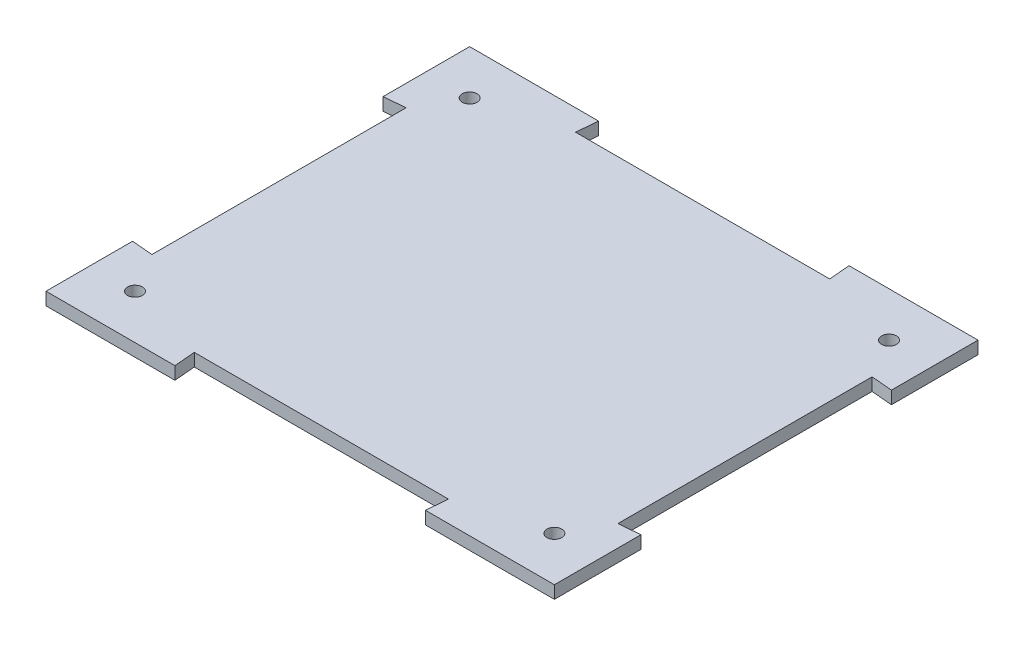
ISO-10303-21;
HEADER;
FILE_DESCRIPTION(('STEP AP214'),'2;1');
FILE_NAME('part.step','',(''),(''),'','','');
FILE_SCHEMA(('AUTOMOTIVE_DESIGN { 1 0 10303 214 1 1 1 1 }'));
ENDSEC;
DATA;
#1=APPLICATION_CONTEXT('core data for automotive mechanical design processes');
#2=APPLICATION_PROTOCOL_DEFINITION('international standard','automotive_design',2000,#1);
#3=PRODUCT_CONTEXT('',#1,'mechanical');
#4=PRODUCT('Part','Part','',(#3));
#5=PRODUCT_RELATED_PRODUCT_CATEGORY('part','',(#4));
#6=PRODUCT_DEFINITION_FORMATION('','',#4);
#7=PRODUCT_DEFINITION_CONTEXT('part definition',#1,'design');
#8=PRODUCT_DEFINITION('design','',#6,#7);
#9=PRODUCT_DEFINITION_SHAPE('','',#8);
#10=(LENGTH_UNIT() NAMED_UNIT(*) SI_UNIT(.MILLI.,.METRE.));
#11=(NAMED_UNIT(*) PLANE_ANGLE_UNIT() SI_UNIT($,.RADIAN.));
#12=(NAMED_UNIT(*) SI_UNIT($,.STERADIAN.) SOLID_ANGLE_UNIT());
#13=UNCERTAINTY_MEASURE_WITH_UNIT(LENGTH_MEASURE(1.E-05),#10,'distance_accuracy_value','');
#14=(GEOMETRIC_REPRESENTATION_CONTEXT(3) GLOBAL_UNCERTAINTY_ASSIGNED_CONTEXT((#13)) GLOBAL_UNIT_ASSIGNED_CONTEXT((#10,
#11,#12)) REPRESENTATION_CONTEXT('',''));
#15=CARTESIAN_POINT('',(0.,0.,0.));
#16=DIRECTION('',(0.,0.,1.));
#17=DIRECTION('',(1.,0.,0.));
#18=AXIS2_PLACEMENT_3D('',#15,#16,#17);
#19=CARTESIAN_POINT('',(0.,3.,0.));
#20=DIRECTION('',(0.,0.,-1.));
#21=DIRECTION('',(-1.,0.,0.));
#22=AXIS2_PLACEMENT_3D('',#19,#20,#21);
#23=PLANE('',#22);
#24=DIRECTION('',(1.,0.,0.));
#25=VECTOR('',#24,1.);
#26=CARTESIAN_POINT('',(0.,0.,0.));
#27=LINE('',#26,#25);
#28=CARTESIAN_POINT('',(0.,0.,0.));
#29=VERTEX_POINT('',#28);
#30=CARTESIAN_POINT('',(30.4374433176297,0.,0.));
#31=VERTEX_POINT('',#30);
#32=EDGE_CURVE('E207',#29,#31,#27,.T.);
#33=ORIENTED_EDGE('',*,*,#32,.T.);
#34=DIRECTION('',(0.,1.,0.));
#35=VECTOR('',#34,1.);
#36=CARTESIAN_POINT('',(30.4374433176297,-7.,0.));
#37=LINE('',#36,#35);
#38=CARTESIAN_POINT('',(30.4374433176297,3.,0.));
#39=VERTEX_POINT('',#38);
#40=EDGE_CURVE('E302',#31,#39,#37,.T.);
#41=ORIENTED_EDGE('',*,*,#40,.T.);
#42=DIRECTION('',(1.,0.,0.));
#43=VECTOR('',#42,1.);
#44=CARTESIAN_POINT('',(0.,3.,0.));
#45=LINE('',#44,#43);
#46=CARTESIAN_POINT('',(0.,3.,0.));
#47=VERTEX_POINT('',#46);
#48=EDGE_CURVE('E267',#47,#39,#45,.T.);
#49=ORIENTED_EDGE('',*,*,#48,.F.);
#50=DIRECTION('',(0.,-1.,0.));
#51=VECTOR('',#50,1.);
#52=CARTESIAN_POINT('',(0.,3.,0.));
#53=LINE('',#52,#51);
#54=EDGE_CURVE('E226',#47,#29,#53,.T.);
#55=ORIENTED_EDGE('',*,*,#54,.T.);
#56=EDGE_LOOP('',(#33,#41,#49,#55));
#57=FACE_BOUND('',#56,.T.);
#58=ADVANCED_FACE('F33',(#57),#23,.F.);
#59=CARTESIAN_POINT('',(120.,3.,0.));
#60=DIRECTION('',(-1.,0.,0.));
#61=DIRECTION('',(0.,0.,1.));
#62=AXIS2_PLACEMENT_3D('',#59,#60,#61);
#63=PLANE('',#62);
#64=DIRECTION('',(0.,0.,-1.));
#65=VECTOR('',#64,1.);
#66=CARTESIAN_POINT('',(120.,0.,0.));
#67=LINE('',#66,#65);
#68=CARTESIAN_POINT('',(120.,0.,0.));
#69=VERTEX_POINT('',#68);
#70=CARTESIAN_POINT('',(120.,0.,-20.4374433176296));
#71=VERTEX_POINT('',#70);
#72=EDGE_CURVE('E211',#69,#71,#67,.T.);
#73=ORIENTED_EDGE('',*,*,#72,.T.);
#74=DIRECTION('',(0.,1.,0.));
#75=VECTOR('',#74,1.);
#76=CARTESIAN_POINT('',(120.,-7.,-20.4374433176296));
#77=LINE('',#76,#75);
#78=CARTESIAN_POINT('',(120.,3.,-20.4374433176296));
#79=VERTEX_POINT('',#78);
#80=EDGE_CURVE('E188',#71,#79,#77,.T.);
#81=ORIENTED_EDGE('',*,*,#80,.T.);
#82=DIRECTION('',(0.,0.,-1.));
#83=VECTOR('',#82,1.);
#84=CARTESIAN_POINT('',(120.,3.,0.));
#85=LINE('',#84,#83);
#86=CARTESIAN_POINT('',(120.,3.,0.));
#87=VERTEX_POINT('',#86);
#88=EDGE_CURVE('E195',#87,#79,#85,.T.);
#89=ORIENTED_EDGE('',*,*,#88,.F.);
#90=DIRECTION('',(0.,-1.,0.));
#91=VECTOR('',#90,1.);
#92=CARTESIAN_POINT('',(120.,3.,0.));
#93=LINE('',#92,#91);
#94=EDGE_CURVE('E223',#87,#69,#93,.T.);
#95=ORIENTED_EDGE('',*,*,#94,.T.);
#96=EDGE_LOOP('',(#73,#81,#89,#95));
#97=FACE_BOUND('',#96,.T.);
#98=ADVANCED_FACE('F371',(#97),#63,.F.);
#99=CARTESIAN_POINT('',(0.,3.,-100.));
#100=DIRECTION('',(0.,0.,1.));
#101=DIRECTION('',(1.,0.,0.));
#102=AXIS2_PLACEMENT_3D('',#99,#100,#101);
#103=PLANE('',#102);
#104=DIRECTION('',(-1.,0.,0.));
#105=VECTOR('',#104,1.);
#106=CARTESIAN_POINT('',(0.,0.,-100.));
#107=LINE('',#106,#105);
#108=CARTESIAN_POINT('',(120.,0.,-100.));
#109=VERTEX_POINT('',#108);
#110=CARTESIAN_POINT('',(89.5625566823704,0.,-100.));
#111=VERTEX_POINT('',#110);
#112=EDGE_CURVE('E215',#109,#111,#107,.T.);
#113=ORIENTED_EDGE('',*,*,#112,.T.);
#114=DIRECTION('',(0.,1.,0.));
#115=VECTOR('',#114,1.);
#116=CARTESIAN_POINT('',(89.5625566823704,-7.,-100.));
#117=LINE('',#116,#115);
#118=CARTESIAN_POINT('',(89.5625566823704,3.,-100.));
#119=VERTEX_POINT('',#118);
#120=EDGE_CURVE('E288',#111,#119,#117,.T.);
#121=ORIENTED_EDGE('',*,*,#120,.T.);
#122=DIRECTION('',(-1.,0.,0.));
#123=VECTOR('',#122,1.);
#124=CARTESIAN_POINT('',(0.,3.,-100.));
#125=LINE('',#124,#123);
#126=CARTESIAN_POINT('',(120.,3.,-100.));
#127=VERTEX_POINT('',#126);
#128=EDGE_CURVE('E194',#127,#119,#125,.T.);
#129=ORIENTED_EDGE('',*,*,#128,.F.);
#130=DIRECTION('',(0.,-1.,0.));
#131=VECTOR('',#130,1.);
#132=CARTESIAN_POINT('',(120.,3.,-100.));
#133=LINE('',#132,#131);
#134=EDGE_CURVE('E220',#127,#109,#133,.T.);
#135=ORIENTED_EDGE('',*,*,#134,.T.);
#136=EDGE_LOOP('',(#113,#121,#129,#135));
#137=FACE_BOUND('',#136,.T.);
#138=ADVANCED_FACE('F287',(#137),#103,.F.);
#139=CARTESIAN_POINT('',(0.,3.,0.));
#140=DIRECTION('',(1.,0.,0.));
#141=DIRECTION('',(0.,0.,-1.));
#142=AXIS2_PLACEMENT_3D('',#139,#140,#141);
#143=PLANE('',#142);
#144=DIRECTION('',(0.,0.,1.));
#145=VECTOR('',#144,1.);
#146=CARTESIAN_POINT('',(0.,0.,0.));
#147=LINE('',#146,#145);
#148=CARTESIAN_POINT('',(0.,0.,-100.));
#149=VERTEX_POINT('',#148);
#150=CARTESIAN_POINT('',(0.,0.,-79.5625566823703));
#151=VERTEX_POINT('',#150);
#152=EDGE_CURVE('E202',#149,#151,#147,.T.);
#153=ORIENTED_EDGE('',*,*,#152,.T.);
#154=DIRECTION('',(0.,1.,0.));
#155=VECTOR('',#154,1.);
#156=CARTESIAN_POINT('',(0.,-7.,-79.5625566823703));
#157=LINE('',#156,#155);
#158=CARTESIAN_POINT('',(0.,3.,-79.5625566823703));
#159=VERTEX_POINT('',#158);
#160=EDGE_CURVE('E263',#151,#159,#157,.T.);
#161=ORIENTED_EDGE('',*,*,#160,.T.);
#162=DIRECTION('',(0.,0.,1.));
#163=VECTOR('',#162,1.);
#164=CARTESIAN_POINT('',(0.,3.,0.));
#165=LINE('',#164,#163);
#166=CARTESIAN_POINT('',(0.,3.,-100.));
#167=VERTEX_POINT('',#166);
#168=EDGE_CURVE('E262',#167,#159,#165,.T.);
#169=ORIENTED_EDGE('',*,*,#168,.F.);
#170=DIRECTION('',(0.,-1.,0.));
#171=VECTOR('',#170,1.);
#172=CARTESIAN_POINT('',(0.,3.,-100.));
#173=LINE('',#172,#171);
#174=EDGE_CURVE('E192',#167,#149,#173,.T.);
#175=ORIENTED_EDGE('',*,*,#174,.T.);
#176=EDGE_LOOP('',(#153,#161,#169,#175));
#177=FACE_BOUND('',#176,.T.);
#178=ADVANCED_FACE('F260',(#177),#143,.F.);
#179=CARTESIAN_POINT('',(0.,3.,-20.4374433176296));
#180=VERTEX_POINT('',#179);
#181=EDGE_CURVE('E218',#180,#47,#165,.T.);
#182=ORIENTED_EDGE('',*,*,#181,.F.);
#183=DIRECTION('',(0.,1.,0.));
#184=VECTOR('',#183,1.);
#185=CARTESIAN_POINT('',(0.,-7.,-20.4374433176296));
#186=LINE('',#185,#184);
#187=CARTESIAN_POINT('',(0.,0.,-20.4374433176296));
#188=VERTEX_POINT('',#187);
#189=EDGE_CURVE('E269',#188,#180,#186,.T.);
#190=ORIENTED_EDGE('',*,*,#189,.F.);
#191=EDGE_CURVE('E206',#188,#29,#147,.T.);
#192=ORIENTED_EDGE('',*,*,#191,.T.);
#193=ORIENTED_EDGE('',*,*,#54,.F.);
#194=EDGE_LOOP('',(#182,#190,#192,#193));
#195=FACE_BOUND('',#194,.T.);
#196=ADVANCED_FACE('F35',(#195),#143,.F.);
#197=CARTESIAN_POINT('',(89.5625566823704,3.,0.));
#198=VERTEX_POINT('',#197);
#199=EDGE_CURVE('E265',#198,#87,#45,.T.);
#200=ORIENTED_EDGE('',*,*,#199,.F.);
#201=DIRECTION('',(0.,1.,0.));
#202=VECTOR('',#201,1.);
#203=CARTESIAN_POINT('',(89.5625566823704,-7.,0.));
#204=LINE('',#203,#202);
#205=CARTESIAN_POINT('',(89.5625566823704,0.,0.));
#206=VERTEX_POINT('',#205);
#207=EDGE_CURVE('E323',#206,#198,#204,.T.);
#208=ORIENTED_EDGE('',*,*,#207,.F.);
#209=EDGE_CURVE('E205',#206,#69,#27,.T.);
#210=ORIENTED_EDGE('',*,*,#209,.T.);
#211=ORIENTED_EDGE('',*,*,#94,.F.);
#212=EDGE_LOOP('',(#200,#208,#210,#211));
#213=FACE_BOUND('',#212,.T.);
#214=ADVANCED_FACE('F367',(#213),#23,.F.);
#215=CARTESIAN_POINT('',(120.,3.,-79.5625566823704));
#216=VERTEX_POINT('',#215);
#217=EDGE_CURVE('E198',#216,#127,#85,.T.);
#218=ORIENTED_EDGE('',*,*,#217,.F.);
#219=DIRECTION('',(0.,1.,0.));
#220=VECTOR('',#219,1.);
#221=CARTESIAN_POINT('',(120.,-7.,-79.5625566823704));
#222=LINE('',#221,#220);
#223=CARTESIAN_POINT('',(120.,0.,-79.5625566823704));
#224=VERTEX_POINT('',#223);
#225=EDGE_CURVE('E307',#224,#216,#222,.T.);
#226=ORIENTED_EDGE('',*,*,#225,.F.);
#227=EDGE_CURVE('E210',#224,#109,#67,.T.);
#228=ORIENTED_EDGE('',*,*,#227,.T.);
#229=ORIENTED_EDGE('',*,*,#134,.F.);
#230=EDGE_LOOP('',(#218,#226,#228,#229));
#231=FACE_BOUND('',#230,.T.);
#232=ADVANCED_FACE('F282',(#231),#63,.F.);
#233=CARTESIAN_POINT('',(30.4374433176296,3.,-100.));
#234=VERTEX_POINT('',#233);
#235=EDGE_CURVE('E183',#234,#167,#125,.T.);
#236=ORIENTED_EDGE('',*,*,#235,.F.);
#237=DIRECTION('',(0.,1.,0.));
#238=VECTOR('',#237,1.);
#239=CARTESIAN_POINT('',(30.4374433176296,-7.,-100.));
#240=LINE('',#239,#238);
#241=CARTESIAN_POINT('',(30.4374433176296,0.,-100.));
#242=VERTEX_POINT('',#241);
#243=EDGE_CURVE('E167',#242,#234,#240,.T.);
#244=ORIENTED_EDGE('',*,*,#243,.F.);
#245=EDGE_CURVE('E214',#242,#149,#107,.T.);
#246=ORIENTED_EDGE('',*,*,#245,.T.);
#247=ORIENTED_EDGE('',*,*,#174,.F.);
#248=EDGE_LOOP('',(#236,#244,#246,#247));
#249=FACE_BOUND('',#248,.T.);
#250=ADVANCED_FACE('F190',(#249),#103,.F.);
#251=CARTESIAN_POINT('',(0.,3.,0.));
#252=DIRECTION('',(0.,-1.,0.));
#253=DIRECTION('',(0.,0.,-1.));
#254=AXIS2_PLACEMENT_3D('',#251,#252,#253);
#255=PLANE('',#254);
#256=CARTESIAN_POINT('',(109.5,3.,-89.5));
#257=DIRECTION('',(0.,1.,0.));
#258=DIRECTION('',(0.,0.,1.));
#259=AXIS2_PLACEMENT_3D('',#256,#257,#258);
#260=CIRCLE('',#259,1.75);
#261=CARTESIAN_POINT('',(109.5,3.,-87.75));
#262=VERTEX_POINT('',#261);
#263=EDGE_CURVE('E387',#262,#262,#260,.T.);
#264=ORIENTED_EDGE('',*,*,#263,.F.);
#265=EDGE_LOOP('',(#264));
#266=FACE_BOUND('',#265,.T.);
#267=CARTESIAN_POINT('',(109.5,3.,-10.5));
#268=DIRECTION('',(0.,1.,0.));
#269=DIRECTION('',(0.,0.,1.));
#270=AXIS2_PLACEMENT_3D('',#267,#268,#269);
#271=CIRCLE('',#270,1.75);
#272=CARTESIAN_POINT('',(109.5,3.,-8.75000000000003));
#273=VERTEX_POINT('',#272);
#274=EDGE_CURVE('E399',#273,#273,#271,.T.);
#275=ORIENTED_EDGE('',*,*,#274,.F.);
#276=EDGE_LOOP('',(#275));
#277=FACE_BOUND('',#276,.T.);
#278=CARTESIAN_POINT('',(10.5,3.,-10.5));
#279=DIRECTION('',(0.,1.,0.));
#280=DIRECTION('',(0.,0.,1.));
#281=AXIS2_PLACEMENT_3D('',#278,#279,#280);
#282=CIRCLE('',#281,1.75);
#283=CARTESIAN_POINT('',(10.5,3.,-8.75000000000002));
#284=VERTEX_POINT('',#283);
#285=EDGE_CURVE('E393',#284,#284,#282,.T.);
#286=ORIENTED_EDGE('',*,*,#285,.F.);
#287=EDGE_LOOP('',(#286));
#288=FACE_BOUND('',#287,.T.);
#289=CARTESIAN_POINT('',(10.5,3.,-89.5));
#290=DIRECTION('',(0.,1.,0.));
#291=DIRECTION('',(0.,0.,1.));
#292=AXIS2_PLACEMENT_3D('',#289,#290,#291);
#293=CIRCLE('',#292,1.75);
#294=CARTESIAN_POINT('',(10.5,3.,-87.75));
#295=VERTEX_POINT('',#294);
#296=EDGE_CURVE('E318',#295,#295,#293,.T.);
#297=ORIENTED_EDGE('',*,*,#296,.F.);
#298=EDGE_LOOP('',(#297));
#299=FACE_BOUND('',#298,.T.);
#300=ORIENTED_EDGE('',*,*,#128,.T.);
#301=DIRECTION('',(-0.0871557427476621,0.,-0.996194698091745));
#302=VECTOR('',#301,1.);
#303=CARTESIAN_POINT('',(90.,3.,-95.));
#304=LINE('',#303,#302);
#305=CARTESIAN_POINT('',(90.,3.,-95.));
#306=VERTEX_POINT('',#305);
#307=EDGE_CURVE('E177',#306,#119,#304,.T.);
#308=ORIENTED_EDGE('',*,*,#307,.F.);
#309=DIRECTION('',(1.,0.,0.));
#310=VECTOR('',#309,1.);
#311=CARTESIAN_POINT('',(30.,3.,-95.));
#312=LINE('',#311,#310);
#313=CARTESIAN_POINT('',(30.,3.,-95.));
#314=VERTEX_POINT('',#313);
#315=EDGE_CURVE('E187',#314,#306,#312,.T.);
#316=ORIENTED_EDGE('',*,*,#315,.F.);
#317=DIRECTION('',(-0.0871557427476608,0.,0.996194698091745));
#318=VECTOR('',#317,1.);
#319=CARTESIAN_POINT('',(30.4374433176296,3.,-100.));
#320=LINE('',#319,#318);
#321=EDGE_CURVE('E170',#234,#314,#320,.T.);
#322=ORIENTED_EDGE('',*,*,#321,.F.);
#323=ORIENTED_EDGE('',*,*,#235,.T.);
#324=ORIENTED_EDGE('',*,*,#168,.T.);
#325=DIRECTION('',(-0.996194698091745,0.,0.0871557427476649));
#326=VECTOR('',#325,1.);
#327=CARTESIAN_POINT('',(0.,3.,-79.5625566823703));
#328=LINE('',#327,#326);
#329=CARTESIAN_POINT('',(5.00000000000001,3.,-80.));
#330=VERTEX_POINT('',#329);
#331=EDGE_CURVE('E333',#330,#159,#328,.T.);
#332=ORIENTED_EDGE('',*,*,#331,.F.);
#333=DIRECTION('',(0.,0.,-1.));
#334=VECTOR('',#333,1.);
#335=CARTESIAN_POINT('',(5.00000000000001,3.,-80.));
#336=LINE('',#335,#334);
#337=CARTESIAN_POINT('',(5.00000000000002,3.,-20.));
#338=VERTEX_POINT('',#337);
#339=EDGE_CURVE('E293',#338,#330,#336,.T.);
#340=ORIENTED_EDGE('',*,*,#339,.F.);
#341=DIRECTION('',(0.996194698091745,0.,0.0871557427476621));
#342=VECTOR('',#341,1.);
#343=CARTESIAN_POINT('',(5.00000000000002,3.,-20.));
#344=LINE('',#343,#342);
#345=EDGE_CURVE('E290',#180,#338,#344,.T.);
#346=ORIENTED_EDGE('',*,*,#345,.F.);
#347=ORIENTED_EDGE('',*,*,#181,.T.);
#348=ORIENTED_EDGE('',*,*,#48,.T.);
#349=DIRECTION('',(0.0871557427476621,0.,0.996194698091745));
#350=VECTOR('',#349,1.);
#351=CARTESIAN_POINT('',(30.4374433176297,3.,0.));
#352=LINE('',#351,#350);
#353=CARTESIAN_POINT('',(30.,3.,-5.00000000000001));
#354=VERTEX_POINT('',#353);
#355=EDGE_CURVE('E321',#354,#39,#352,.T.);
#356=ORIENTED_EDGE('',*,*,#355,.F.);
#357=DIRECTION('',(-1.,0.,0.));
#358=VECTOR('',#357,1.);
#359=CARTESIAN_POINT('',(30.,3.,-5.00000000000001));
#360=LINE('',#359,#358);
#361=CARTESIAN_POINT('',(90.,3.,-5.00000000000002));
#362=VERTEX_POINT('',#361);
#363=EDGE_CURVE('E317',#362,#354,#360,.T.);
#364=ORIENTED_EDGE('',*,*,#363,.F.);
#365=DIRECTION('',(0.0871557427476621,0.,-0.996194698091745));
#366=VECTOR('',#365,1.);
#367=CARTESIAN_POINT('',(90.,3.,-5.00000000000002));
#368=LINE('',#367,#366);
#369=EDGE_CURVE('E314',#198,#362,#368,.T.);
#370=ORIENTED_EDGE('',*,*,#369,.F.);
#371=ORIENTED_EDGE('',*,*,#199,.T.);
#372=ORIENTED_EDGE('',*,*,#88,.T.);
#373=DIRECTION('',(0.996194698091745,0.,-0.0871557427476628));
#374=VECTOR('',#373,1.);
#375=CARTESIAN_POINT('',(115.,3.,-20.));
#376=LINE('',#375,#374);
#377=CARTESIAN_POINT('',(115.,3.,-20.));
#378=VERTEX_POINT('',#377);
#379=EDGE_CURVE('E305',#378,#79,#376,.T.);
#380=ORIENTED_EDGE('',*,*,#379,.F.);
#381=DIRECTION('',(0.,0.,1.));
#382=VECTOR('',#381,1.);
#383=CARTESIAN_POINT('',(115.,3.,-80.));
#384=LINE('',#383,#382);
#385=CARTESIAN_POINT('',(115.,3.,-80.));
#386=VERTEX_POINT('',#385);
#387=EDGE_CURVE('E301',#386,#378,#384,.T.);
#388=ORIENTED_EDGE('',*,*,#387,.F.);
#389=DIRECTION('',(-0.996194698091745,0.,-0.0871557427476621));
#390=VECTOR('',#389,1.);
#391=CARTESIAN_POINT('',(120.,3.,-79.5625566823704));
#392=LINE('',#391,#390);
#393=EDGE_CURVE('E279',#216,#386,#392,.T.);
#394=ORIENTED_EDGE('',*,*,#393,.F.);
#395=ORIENTED_EDGE('',*,*,#217,.T.);
#396=EDGE_LOOP('',(#300,#308,#316,#322,#323,#324,#332,#340,#346,#347,#348,#356,#364,#370,#371,
#372,#380,#388,#394,#395));
#397=FACE_BOUND('',#396,.T.);
#398=ADVANCED_FACE('F181',(#266,#277,#288,#299,#397),#255,.F.);
#399=CARTESIAN_POINT('',(0.,0.,0.));
#400=DIRECTION('',(0.,-1.,0.));
#401=DIRECTION('',(0.,0.,-1.));
#402=AXIS2_PLACEMENT_3D('',#399,#400,#401);
#403=PLANE('',#402);
#404=CARTESIAN_POINT('',(109.5,0.,-89.5));
#405=DIRECTION('',(0.,-1.,0.));
#406=DIRECTION('',(0.,0.,-1.));
#407=AXIS2_PLACEMENT_3D('',#404,#405,#406);
#408=CIRCLE('',#407,1.75);
#409=CARTESIAN_POINT('',(109.5,0.,-87.75));
#410=VERTEX_POINT('',#409);
#411=EDGE_CURVE('E402',#410,#410,#408,.F.);
#412=ORIENTED_EDGE('',*,*,#411,.T.);
#413=EDGE_LOOP('',(#412));
#414=FACE_BOUND('',#413,.T.);
#415=CARTESIAN_POINT('',(109.5,0.,-10.5));
#416=DIRECTION('',(0.,-1.,0.));
#417=DIRECTION('',(0.,0.,-1.));
#418=AXIS2_PLACEMENT_3D('',#415,#416,#417);
#419=CIRCLE('',#418,1.75);
#420=CARTESIAN_POINT('',(109.5,0.,-8.75000000000003));
#421=VERTEX_POINT('',#420);
#422=EDGE_CURVE('E396',#421,#421,#419,.F.);
#423=ORIENTED_EDGE('',*,*,#422,.T.);
#424=EDGE_LOOP('',(#423));
#425=FACE_BOUND('',#424,.T.);
#426=CARTESIAN_POINT('',(10.5,0.,-10.5));
#427=DIRECTION('',(0.,-1.,0.));
#428=DIRECTION('',(0.,0.,-1.));
#429=AXIS2_PLACEMENT_3D('',#426,#427,#428);
#430=CIRCLE('',#429,1.75);
#431=CARTESIAN_POINT('',(10.5,0.,-8.75000000000002));
#432=VERTEX_POINT('',#431);
#433=EDGE_CURVE('E390',#432,#432,#430,.F.);
#434=ORIENTED_EDGE('',*,*,#433,.T.);
#435=EDGE_LOOP('',(#434));
#436=FACE_BOUND('',#435,.T.);
#437=CARTESIAN_POINT('',(10.5,0.,-89.5));
#438=DIRECTION('',(0.,-1.,0.));
#439=DIRECTION('',(0.,0.,-1.));
#440=AXIS2_PLACEMENT_3D('',#437,#438,#439);
#441=CIRCLE('',#440,1.75);
#442=CARTESIAN_POINT('',(10.5,0.,-87.75));
#443=VERTEX_POINT('',#442);
#444=EDGE_CURVE('E384',#443,#443,#441,.F.);
#445=ORIENTED_EDGE('',*,*,#444,.T.);
#446=EDGE_LOOP('',(#445));
#447=FACE_BOUND('',#446,.T.);
#448=DIRECTION('',(0.0871557427476621,0.,0.996194698091745));
#449=VECTOR('',#448,1.);
#450=CARTESIAN_POINT('',(97.5646373247289,0.,-8.5357997269324));
#451=LINE('',#450,#449);
#452=CARTESIAN_POINT('',(90.,0.,-95.));
#453=VERTEX_POINT('',#452);
#454=EDGE_CURVE('E11',#111,#453,#451,.T.);
#455=ORIENTED_EDGE('',*,*,#454,.F.);
#456=ORIENTED_EDGE('',*,*,#112,.F.);
#457=ORIENTED_EDGE('',*,*,#227,.F.);
#458=DIRECTION('',(0.996194698091745,0.,0.0871557427476621));
#459=VECTOR('',#458,1.);
#460=CARTESIAN_POINT('',(7.81948130847565,0.,-89.3770803363372));
#461=LINE('',#460,#459);
#462=CARTESIAN_POINT('',(115.,0.,-80.));
#463=VERTEX_POINT('',#462);
#464=EDGE_CURVE('E243',#463,#224,#461,.T.);
#465=ORIENTED_EDGE('',*,*,#464,.F.);
#466=DIRECTION('',(0.,0.,-1.));
#467=VECTOR('',#466,1.);
#468=CARTESIAN_POINT('',(115.,0.,0.));
#469=LINE('',#468,#467);
#470=CARTESIAN_POINT('',(115.,0.,-20.));
#471=VERTEX_POINT('',#470);
#472=EDGE_CURVE('E245',#471,#463,#469,.T.);
#473=ORIENTED_EDGE('',*,*,#472,.F.);
#474=DIRECTION('',(-0.996194698091745,0.,0.0871557427476628));
#475=VECTOR('',#474,1.);
#476=CARTESIAN_POINT('',(-0.862927574871265,0.,-9.86330731427304));
#477=LINE('',#476,#475);
#478=EDGE_CURVE('E247',#71,#471,#477,.T.);
#479=ORIENTED_EDGE('',*,*,#478,.F.);
#480=ORIENTED_EDGE('',*,*,#72,.F.);
#481=ORIENTED_EDGE('',*,*,#209,.F.);
#482=DIRECTION('',(-0.0871557427476621,0.,0.996194698091745));
#483=VECTOR('',#482,1.);
#484=CARTESIAN_POINT('',(88.882228441382,0.,7.77618737754273));
#485=LINE('',#484,#483);
#486=CARTESIAN_POINT('',(90.,0.,-5.00000000000002));
#487=VERTEX_POINT('',#486);
#488=EDGE_CURVE('E236',#487,#206,#485,.T.);
#489=ORIENTED_EDGE('',*,*,#488,.F.);
#490=DIRECTION('',(1.,0.,0.));
#491=VECTOR('',#490,1.);
#492=CARTESIAN_POINT('',(0.,0.,-5.));
#493=LINE('',#492,#491);
#494=CARTESIAN_POINT('',(30.,0.,-5.00000000000001));
#495=VERTEX_POINT('',#494);
#496=EDGE_CURVE('E238',#495,#487,#493,.T.);
#497=ORIENTED_EDGE('',*,*,#496,.F.);
#498=DIRECTION('',(-0.0871557427476621,0.,-0.996194698091745));
#499=VECTOR('',#498,1.);
#500=CARTESIAN_POINT('',(30.2062367393505,0.,-2.64270328247356));
#501=LINE('',#500,#499);
#502=EDGE_CURVE('E241',#31,#495,#501,.T.);
#503=ORIENTED_EDGE('',*,*,#502,.F.);
#504=ORIENTED_EDGE('',*,*,#32,.F.);
#505=ORIENTED_EDGE('',*,*,#191,.F.);
#506=DIRECTION('',(-0.996194698091745,0.,-0.0871557427476621));
#507=VECTOR('',#506,1.);
#508=CARTESIAN_POINT('',(1.77446239413886,0.,-20.2821979742894));
#509=LINE('',#508,#507);
#510=CARTESIAN_POINT('',(5.00000000000002,0.,-20.));
#511=VERTEX_POINT('',#510);
#512=EDGE_CURVE('E229',#511,#188,#509,.T.);
#513=ORIENTED_EDGE('',*,*,#512,.F.);
#514=DIRECTION('',(0.,0.,1.));
#515=VECTOR('',#514,1.);
#516=CARTESIAN_POINT('',(5.00000000000002,0.,0.));
#517=LINE('',#516,#515);
#518=CARTESIAN_POINT('',(5.00000000000001,0.,-80.));
#519=VERTEX_POINT('',#518);
#520=EDGE_CURVE('E231',#519,#511,#517,.T.);
#521=ORIENTED_EDGE('',*,*,#520,.F.);
#522=DIRECTION('',(0.996194698091745,0.,-0.0871557427476649));
#523=VECTOR('',#522,1.);
#524=CARTESIAN_POINT('',(-6.90794648920826,0.,-78.9581896763209));
#525=LINE('',#524,#523);
#526=EDGE_CURVE('E234',#151,#519,#525,.T.);
#527=ORIENTED_EDGE('',*,*,#526,.F.);
#528=ORIENTED_EDGE('',*,*,#152,.F.);
#529=ORIENTED_EDGE('',*,*,#245,.F.);
#530=DIRECTION('',(0.0871557427476608,0.,-0.996194698091745));
#531=VECTOR('',#530,1.);
#532=CARTESIAN_POINT('',(21.5238278560037,0.,1.88309093308387));
#533=LINE('',#532,#531);
#534=CARTESIAN_POINT('',(30.,0.,-95.));
#535=VERTEX_POINT('',#534);
#536=EDGE_CURVE('E173',#535,#242,#533,.T.);
#537=ORIENTED_EDGE('',*,*,#536,.F.);
#538=DIRECTION('',(-1.,0.,0.));
#539=VECTOR('',#538,1.);
#540=CARTESIAN_POINT('',(0.,0.,-95.));
#541=LINE('',#540,#539);
#542=EDGE_CURVE('E41',#453,#535,#541,.T.);
#543=ORIENTED_EDGE('',*,*,#542,.F.);
#544=EDGE_LOOP('',(#455,#456,#457,#465,#473,#479,#480,#481,#489,#497,#503,#504,#505,#513,#521,
#527,#528,#529,#537,#543));
#545=FACE_BOUND('',#544,.T.);
#546=ADVANCED_FACE('F256',(#414,#425,#436,#447,#545),#403,.T.);
#547=CARTESIAN_POINT('',(0.,-7.,-79.5625566823703));
#548=DIRECTION('',(-0.0871557427476649,0.,-0.996194698091745));
#549=DIRECTION('',(-0.996194698091745,0.,0.0871557427476649));
#550=AXIS2_PLACEMENT_3D('',#547,#548,#549);
#551=PLANE('',#550);
#552=ORIENTED_EDGE('',*,*,#526,.T.);
#553=DIRECTION('',(0.,1.,0.));
#554=VECTOR('',#553,1.);
#555=CARTESIAN_POINT('',(5.00000000000001,-7.,-80.));
#556=LINE('',#555,#554);
#557=EDGE_CURVE('E336',#519,#330,#556,.T.);
#558=ORIENTED_EDGE('',*,*,#557,.T.);
#559=ORIENTED_EDGE('',*,*,#331,.T.);
#560=ORIENTED_EDGE('',*,*,#160,.F.);
#561=EDGE_LOOP('',(#552,#558,#559,#560));
#562=FACE_BOUND('',#561,.T.);
#563=ADVANCED_FACE('F471',(#562),#551,.F.);
#564=CARTESIAN_POINT('',(5.00000000000001,-7.,-80.));
#565=DIRECTION('',(1.,0.,0.));
#566=DIRECTION('',(0.,0.,-1.));
#567=AXIS2_PLACEMENT_3D('',#564,#565,#566);
#568=PLANE('',#567);
#569=ORIENTED_EDGE('',*,*,#520,.T.);
#570=DIRECTION('',(0.,1.,0.));
#571=VECTOR('',#570,1.);
#572=CARTESIAN_POINT('',(5.00000000000002,-7.,-20.));
#573=LINE('',#572,#571);
#574=EDGE_CURVE('E337',#511,#338,#573,.T.);
#575=ORIENTED_EDGE('',*,*,#574,.T.);
#576=ORIENTED_EDGE('',*,*,#339,.T.);
#577=ORIENTED_EDGE('',*,*,#557,.F.);
#578=EDGE_LOOP('',(#569,#575,#576,#577));
#579=FACE_BOUND('',#578,.T.);
#580=ADVANCED_FACE('F477',(#579),#568,.F.);
#581=CARTESIAN_POINT('',(5.00000000000002,-7.,-20.));
#582=DIRECTION('',(-0.0871557427476621,0.,0.996194698091745));
#583=DIRECTION('',(0.996194698091745,0.,0.0871557427476621));
#584=AXIS2_PLACEMENT_3D('',#581,#582,#583);
#585=PLANE('',#584);
#586=ORIENTED_EDGE('',*,*,#512,.T.);
#587=ORIENTED_EDGE('',*,*,#189,.T.);
#588=ORIENTED_EDGE('',*,*,#345,.T.);
#589=ORIENTED_EDGE('',*,*,#574,.F.);
#590=EDGE_LOOP('',(#586,#587,#588,#589));
#591=FACE_BOUND('',#590,.T.);
#592=ADVANCED_FACE('F342',(#591),#585,.F.);
#593=CARTESIAN_POINT('',(30.4374433176297,-7.,0.));
#594=DIRECTION('',(-0.996194698091745,0.,0.0871557427476621));
#595=DIRECTION('',(0.0871557427476621,0.,0.996194698091745));
#596=AXIS2_PLACEMENT_3D('',#593,#594,#595);
#597=PLANE('',#596);
#598=ORIENTED_EDGE('',*,*,#502,.T.);
#599=DIRECTION('',(0.,1.,0.));
#600=VECTOR('',#599,1.);
#601=CARTESIAN_POINT('',(30.,-7.,-5.00000000000001));
#602=LINE('',#601,#600);
#603=EDGE_CURVE('E326',#495,#354,#602,.T.);
#604=ORIENTED_EDGE('',*,*,#603,.T.);
#605=ORIENTED_EDGE('',*,*,#355,.T.);
#606=ORIENTED_EDGE('',*,*,#40,.F.);
#607=EDGE_LOOP('',(#598,#604,#605,#606));
#608=FACE_BOUND('',#607,.T.);
#609=ADVANCED_FACE('F353',(#608),#597,.F.);
#610=CARTESIAN_POINT('',(30.,-7.,-5.00000000000001));
#611=DIRECTION('',(0.,0.,-1.));
#612=DIRECTION('',(-1.,0.,0.));
#613=AXIS2_PLACEMENT_3D('',#610,#611,#612);
#614=PLANE('',#613);
#615=ORIENTED_EDGE('',*,*,#496,.T.);
#616=DIRECTION('',(0.,1.,0.));
#617=VECTOR('',#616,1.);
#618=CARTESIAN_POINT('',(90.,-7.,-5.00000000000002));
#619=LINE('',#618,#617);
#620=EDGE_CURVE('E328',#487,#362,#619,.T.);
#621=ORIENTED_EDGE('',*,*,#620,.T.);
#622=ORIENTED_EDGE('',*,*,#363,.T.);
#623=ORIENTED_EDGE('',*,*,#603,.F.);
#624=EDGE_LOOP('',(#615,#621,#622,#623));
#625=FACE_BOUND('',#624,.T.);
#626=ADVANCED_FACE('F359',(#625),#614,.F.);
#627=CARTESIAN_POINT('',(90.,-7.,-5.00000000000002));
#628=DIRECTION('',(0.996194698091745,0.,0.0871557427476621));
#629=DIRECTION('',(0.0871557427476621,0.,-0.996194698091745));
#630=AXIS2_PLACEMENT_3D('',#627,#628,#629);
#631=PLANE('',#630);
#632=ORIENTED_EDGE('',*,*,#488,.T.);
#633=ORIENTED_EDGE('',*,*,#207,.T.);
#634=ORIENTED_EDGE('',*,*,#369,.T.);
#635=ORIENTED_EDGE('',*,*,#620,.F.);
#636=EDGE_LOOP('',(#632,#633,#634,#635));
#637=FACE_BOUND('',#636,.T.);
#638=ADVANCED_FACE('F503',(#637),#631,.F.);
#639=CARTESIAN_POINT('',(115.,-7.,-20.));
#640=DIRECTION('',(0.0871557427476628,0.,0.996194698091745));
#641=DIRECTION('',(0.996194698091745,0.,-0.0871557427476628));
#642=AXIS2_PLACEMENT_3D('',#639,#640,#641);
#643=PLANE('',#642);
#644=ORIENTED_EDGE('',*,*,#478,.T.);
#645=DIRECTION('',(0.,1.,0.));
#646=VECTOR('',#645,1.);
#647=CARTESIAN_POINT('',(115.,-7.,-20.));
#648=LINE('',#647,#646);
#649=EDGE_CURVE('E310',#471,#378,#648,.T.);
#650=ORIENTED_EDGE('',*,*,#649,.T.);
#651=ORIENTED_EDGE('',*,*,#379,.T.);
#652=ORIENTED_EDGE('',*,*,#80,.F.);
#653=EDGE_LOOP('',(#644,#650,#651,#652));
#654=FACE_BOUND('',#653,.T.);
#655=ADVANCED_FACE('F374',(#654),#643,.F.);
#656=CARTESIAN_POINT('',(115.,-7.,-80.));
#657=DIRECTION('',(-1.,0.,0.));
#658=DIRECTION('',(0.,0.,1.));
#659=AXIS2_PLACEMENT_3D('',#656,#657,#658);
#660=PLANE('',#659);
#661=ORIENTED_EDGE('',*,*,#472,.T.);
#662=DIRECTION('',(0.,1.,0.));
#663=VECTOR('',#662,1.);
#664=CARTESIAN_POINT('',(115.,-7.,-80.));
#665=LINE('',#664,#663);
#666=EDGE_CURVE('E56',#463,#386,#665,.T.);
#667=ORIENTED_EDGE('',*,*,#666,.T.);
#668=ORIENTED_EDGE('',*,*,#387,.T.);
#669=ORIENTED_EDGE('',*,*,#649,.F.);
#670=EDGE_LOOP('',(#661,#667,#668,#669));
#671=FACE_BOUND('',#670,.T.);
#672=ADVANCED_FACE('F379',(#671),#660,.F.);
#673=CARTESIAN_POINT('',(120.,-7.,-79.5625566823704));
#674=DIRECTION('',(0.0871557427476621,0.,-0.996194698091745));
#675=DIRECTION('',(-0.996194698091745,0.,-0.0871557427476621));
#676=AXIS2_PLACEMENT_3D('',#673,#674,#675);
#677=PLANE('',#676);
#678=ORIENTED_EDGE('',*,*,#464,.T.);
#679=ORIENTED_EDGE('',*,*,#225,.T.);
#680=ORIENTED_EDGE('',*,*,#393,.T.);
#681=ORIENTED_EDGE('',*,*,#666,.F.);
#682=EDGE_LOOP('',(#678,#679,#680,#681));
#683=FACE_BOUND('',#682,.T.);
#684=ADVANCED_FACE('F381',(#683),#677,.F.);
#685=CARTESIAN_POINT('',(90.,-7.,-95.));
#686=DIRECTION('',(0.996194698091745,0.,-0.0871557427476621));
#687=DIRECTION('',(-0.0871557427476621,0.,-0.996194698091745));
#688=AXIS2_PLACEMENT_3D('',#685,#686,#687);
#689=PLANE('',#688);
#690=ORIENTED_EDGE('',*,*,#454,.T.);
#691=DIRECTION('',(0.,1.,0.));
#692=VECTOR('',#691,1.);
#693=CARTESIAN_POINT('',(90.,-7.,-95.));
#694=LINE('',#693,#692);
#695=EDGE_CURVE('E253',#453,#306,#694,.T.);
#696=ORIENTED_EDGE('',*,*,#695,.T.);
#697=ORIENTED_EDGE('',*,*,#307,.T.);
#698=ORIENTED_EDGE('',*,*,#120,.F.);
#699=EDGE_LOOP('',(#690,#696,#697,#698));
#700=FACE_BOUND('',#699,.T.);
#701=ADVANCED_FACE('F382',(#700),#689,.F.);
#702=CARTESIAN_POINT('',(30.,-7.,-95.));
#703=DIRECTION('',(0.,0.,1.));
#704=DIRECTION('',(1.,0.,0.));
#705=AXIS2_PLACEMENT_3D('',#702,#703,#704);
#706=PLANE('',#705);
#707=ORIENTED_EDGE('',*,*,#542,.T.);
#708=DIRECTION('',(0.,1.,0.));
#709=VECTOR('',#708,1.);
#710=CARTESIAN_POINT('',(30.,-7.,-95.));
#711=LINE('',#710,#709);
#712=EDGE_CURVE('E48',#535,#314,#711,.T.);
#713=ORIENTED_EDGE('',*,*,#712,.T.);
#714=ORIENTED_EDGE('',*,*,#315,.T.);
#715=ORIENTED_EDGE('',*,*,#695,.F.);
#716=EDGE_LOOP('',(#707,#713,#714,#715));
#717=FACE_BOUND('',#716,.T.);
#718=ADVANCED_FACE('F252',(#717),#706,.F.);
#719=CARTESIAN_POINT('',(30.4374433176296,-7.,-100.));
#720=DIRECTION('',(-0.996194698091745,0.,-0.0871557427476608));
#721=DIRECTION('',(-0.0871557427476608,0.,0.996194698091745));
#722=AXIS2_PLACEMENT_3D('',#719,#720,#721);
#723=PLANE('',#722);
#724=ORIENTED_EDGE('',*,*,#536,.T.);
#725=ORIENTED_EDGE('',*,*,#243,.T.);
#726=ORIENTED_EDGE('',*,*,#321,.T.);
#727=ORIENTED_EDGE('',*,*,#712,.F.);
#728=EDGE_LOOP('',(#724,#725,#726,#727));
#729=FACE_BOUND('',#728,.T.);
#730=ADVANCED_FACE('F169',(#729),#723,.F.);
#731=CARTESIAN_POINT('',(10.5,-0.00100000000000013,-89.5));
#732=DIRECTION('',(0.,1.,0.));
#733=DIRECTION('',(0.,0.,1.));
#734=AXIS2_PLACEMENT_3D('',#731,#732,#733);
#735=CYLINDRICAL_SURFACE('',#734,1.75);
#736=CARTESIAN_POINT('',(10.5,0.,-87.75));
#737=CARTESIAN_POINT('',(10.5,0.03125,-87.75));
#738=CARTESIAN_POINT('',(10.5,0.0625,-87.75));
#739=CARTESIAN_POINT('',(10.5,0.125,-87.75));
#740=CARTESIAN_POINT('',(10.5,0.15625,-87.75));
#741=CARTESIAN_POINT('',(10.5,0.21875,-87.75));
#742=CARTESIAN_POINT('',(10.5,0.25,-87.75));
#743=CARTESIAN_POINT('',(10.5,0.3125,-87.75));
#744=CARTESIAN_POINT('',(10.5,0.34375,-87.75));
#745=CARTESIAN_POINT('',(10.5,0.40625,-87.75));
#746=CARTESIAN_POINT('',(10.5,0.4375,-87.75));
#747=CARTESIAN_POINT('',(10.5,0.5,-87.75));
#748=CARTESIAN_POINT('',(10.5,0.53125,-87.75));
#749=CARTESIAN_POINT('',(10.5,0.59375,-87.75));
#750=CARTESIAN_POINT('',(10.5,0.625,-87.75));
#751=CARTESIAN_POINT('',(10.5,0.6875,-87.75));
#752=CARTESIAN_POINT('',(10.5,0.71875,-87.75));
#753=CARTESIAN_POINT('',(10.5,0.78125,-87.75));
#754=CARTESIAN_POINT('',(10.5,0.8125,-87.75));
#755=CARTESIAN_POINT('',(10.5,0.875,-87.75));
#756=CARTESIAN_POINT('',(10.5,0.90625,-87.75));
#757=CARTESIAN_POINT('',(10.5,0.96875,-87.75));
#758=CARTESIAN_POINT('',(10.5,1.,-87.75));
#759=CARTESIAN_POINT('',(10.5,1.0625,-87.75));
#760=CARTESIAN_POINT('',(10.5,1.09375,-87.75));
#761=CARTESIAN_POINT('',(10.5,1.15625,-87.75));
#762=CARTESIAN_POINT('',(10.5,1.1875,-87.75));
#763=CARTESIAN_POINT('',(10.5,1.25,-87.75));
#764=CARTESIAN_POINT('',(10.5,1.28125,-87.75));
#765=CARTESIAN_POINT('',(10.5,1.34375,-87.75));
#766=CARTESIAN_POINT('',(10.5,1.375,-87.75));
#767=CARTESIAN_POINT('',(10.5,1.4375,-87.75));
#768=CARTESIAN_POINT('',(10.5,1.46875,-87.75));
#769=CARTESIAN_POINT('',(10.5,1.53125,-87.75));
#770=CARTESIAN_POINT('',(10.5,1.5625,-87.75));
#771=CARTESIAN_POINT('',(10.5,1.625,-87.75));
#772=CARTESIAN_POINT('',(10.5,1.65625,-87.75));
#773=CARTESIAN_POINT('',(10.5,1.71875,-87.75));
#774=CARTESIAN_POINT('',(10.5,1.75,-87.75));
#775=CARTESIAN_POINT('',(10.5,1.8125,-87.75));
#776=CARTESIAN_POINT('',(10.5,1.84375,-87.75));
#777=CARTESIAN_POINT('',(10.5,1.90625,-87.75));
#778=CARTESIAN_POINT('',(10.5,1.9375,-87.75));
#779=CARTESIAN_POINT('',(10.5,2.,-87.75));
#780=CARTESIAN_POINT('',(10.5,2.03125,-87.75));
#781=CARTESIAN_POINT('',(10.5,2.09375,-87.75));
#782=CARTESIAN_POINT('',(10.5,2.125,-87.75));
#783=CARTESIAN_POINT('',(10.5,2.1875,-87.75));
#784=CARTESIAN_POINT('',(10.5,2.21875,-87.75));
#785=CARTESIAN_POINT('',(10.5,2.28125,-87.75));
#786=CARTESIAN_POINT('',(10.5,2.3125,-87.75));
#787=CARTESIAN_POINT('',(10.5,2.375,-87.75));
#788=CARTESIAN_POINT('',(10.5,2.40625,-87.75));
#789=CARTESIAN_POINT('',(10.5,2.46875,-87.75));
#790=CARTESIAN_POINT('',(10.5,2.5,-87.75));
#791=CARTESIAN_POINT('',(10.5,2.5625,-87.75));
#792=CARTESIAN_POINT('',(10.5,2.59375,-87.75));
#793=CARTESIAN_POINT('',(10.5,2.65625,-87.75));
#794=CARTESIAN_POINT('',(10.5,2.6875,-87.75));
#795=CARTESIAN_POINT('',(10.5,2.75,-87.75));
#796=CARTESIAN_POINT('',(10.5,2.78125,-87.75));
#797=CARTESIAN_POINT('',(10.5,2.84375,-87.75));
#798=CARTESIAN_POINT('',(10.5,2.875,-87.75));
#799=CARTESIAN_POINT('',(10.5,2.9375,-87.75));
#800=CARTESIAN_POINT('',(10.5,2.96875,-87.75));
#801=CARTESIAN_POINT('',(10.5,3.,-87.75));
#802=B_SPLINE_CURVE_WITH_KNOTS('',3,(#736,#737,#738,#739,#740,#741,#742,#743,#744,#745,#746,
#747,#748,#749,#750,#751,#752,#753,#754,#755,#756,#757,#758,#759,#760,#761,#762,#763,#764,#765,
#766,#767,#768,#769,#770,#771,#772,#773,#774,#775,#776,#777,#778,#779,#780,#781,#782,#783,#784,
#785,#786,#787,#788,#789,#790,#791,#792,#793,#794,#795,#796,#797,#798,#799,#800,#801),
.UNSPECIFIED.,.F.,.F.,(4,2,2,2,2,2,2,2,2,2,2,2,2,2,2,2,2,2,2,2,2,2,2,2,2,2,2,2,2,2,2,2,4),(0.,
0.09375,0.1875,0.28125,0.375,0.46875,0.5625,0.65625,0.75,0.84375,0.9375,1.03125,1.125,1.21875,
1.3125,1.40625,1.5,1.59375,1.6875,1.78125,1.875,1.96875,2.0625,2.15625,2.25,2.34375,2.4375,
2.53125,2.625,2.71875,2.8125,2.90625,3.),.UNSPECIFIED.);
#803=EDGE_CURVE('BSEAM419',#443,#295,#802,.T.);
#804=ORIENTED_EDGE('',*,*,#444,.F.);
#805=ORIENTED_EDGE('',*,*,#296,.T.);
#806=ORIENTED_EDGE('',*,*,#803,.T.);
#807=ORIENTED_EDGE('',*,*,#803,.F.);
#808=EDGE_LOOP('',(#804,#806,#805,#807));
#809=FACE_BOUND('',#808,.T.);
#810=ADVANCED_FACE('F419',(#809),#735,.F.);
#811=CARTESIAN_POINT('',(10.5,-0.00100000000000013,-10.5));
#812=DIRECTION('',(0.,1.,0.));
#813=DIRECTION('',(0.,0.,1.));
#814=AXIS2_PLACEMENT_3D('',#811,#812,#813);
#815=CYLINDRICAL_SURFACE('',#814,1.75);
#816=CARTESIAN_POINT('',(10.5,0.,-8.75000000000002));
#817=CARTESIAN_POINT('',(10.5,0.03125,-8.75000000000002));
#818=CARTESIAN_POINT('',(10.5,0.0625,-8.75000000000002));
#819=CARTESIAN_POINT('',(10.5,0.125,-8.75000000000002));
#820=CARTESIAN_POINT('',(10.5,0.15625,-8.75000000000002));
#821=CARTESIAN_POINT('',(10.5,0.21875,-8.75000000000002));
#822=CARTESIAN_POINT('',(10.5,0.25,-8.75000000000002));
#823=CARTESIAN_POINT('',(10.5,0.3125,-8.75000000000002));
#824=CARTESIAN_POINT('',(10.5,0.34375,-8.75000000000002));
#825=CARTESIAN_POINT('',(10.5,0.40625,-8.75000000000002));
#826=CARTESIAN_POINT('',(10.5,0.4375,-8.75000000000002));
#827=CARTESIAN_POINT('',(10.5,0.5,-8.75000000000002));
#828=CARTESIAN_POINT('',(10.5,0.53125,-8.75000000000002));
#829=CARTESIAN_POINT('',(10.5,0.59375,-8.75000000000002));
#830=CARTESIAN_POINT('',(10.5,0.625,-8.75000000000002));
#831=CARTESIAN_POINT('',(10.5,0.6875,-8.75000000000002));
#832=CARTESIAN_POINT('',(10.5,0.71875,-8.75000000000002));
#833=CARTESIAN_POINT('',(10.5,0.78125,-8.75000000000002));
#834=CARTESIAN_POINT('',(10.5,0.8125,-8.75000000000002));
#835=CARTESIAN_POINT('',(10.5,0.875,-8.75000000000002));
#836=CARTESIAN_POINT('',(10.5,0.90625,-8.75000000000002));
#837=CARTESIAN_POINT('',(10.5,0.96875,-8.75000000000002));
#838=CARTESIAN_POINT('',(10.5,1.,-8.75000000000002));
#839=CARTESIAN_POINT('',(10.5,1.0625,-8.75000000000002));
#840=CARTESIAN_POINT('',(10.5,1.09375,-8.75000000000002));
#841=CARTESIAN_POINT('',(10.5,1.15625,-8.75000000000002));
#842=CARTESIAN_POINT('',(10.5,1.1875,-8.75000000000002));
#843=CARTESIAN_POINT('',(10.5,1.25,-8.75000000000002));
#844=CARTESIAN_POINT('',(10.5,1.28125,-8.75000000000002));
#845=CARTESIAN_POINT('',(10.5,1.34375,-8.75000000000002));
#846=CARTESIAN_POINT('',(10.5,1.375,-8.75000000000002));
#847=CARTESIAN_POINT('',(10.5,1.4375,-8.75000000000002));
#848=CARTESIAN_POINT('',(10.5,1.46875,-8.75000000000002));
#849=CARTESIAN_POINT('',(10.5,1.53125,-8.75000000000002));
#850=CARTESIAN_POINT('',(10.5,1.5625,-8.75000000000002));
#851=CARTESIAN_POINT('',(10.5,1.625,-8.75000000000002));
#852=CARTESIAN_POINT('',(10.5,1.65625,-8.75000000000002));
#853=CARTESIAN_POINT('',(10.5,1.71875,-8.75000000000002));
#854=CARTESIAN_POINT('',(10.5,1.75,-8.75000000000002));
#855=CARTESIAN_POINT('',(10.5,1.8125,-8.75000000000002));
#856=CARTESIAN_POINT('',(10.5,1.84375,-8.75000000000002));
#857=CARTESIAN_POINT('',(10.5,1.90625,-8.75000000000002));
#858=CARTESIAN_POINT('',(10.5,1.9375,-8.75000000000002));
#859=CARTESIAN_POINT('',(10.5,2.,-8.75000000000002));
#860=CARTESIAN_POINT('',(10.5,2.03125,-8.75000000000002));
#861=CARTESIAN_POINT('',(10.5,2.09375,-8.75000000000002));
#862=CARTESIAN_POINT('',(10.5,2.125,-8.75000000000002));
#863=CARTESIAN_POINT('',(10.5,2.1875,-8.75000000000002));
#864=CARTESIAN_POINT('',(10.5,2.21875,-8.75000000000002));
#865=CARTESIAN_POINT('',(10.5,2.28125,-8.75000000000002));
#866=CARTESIAN_POINT('',(10.5,2.3125,-8.75000000000002));
#867=CARTESIAN_POINT('',(10.5,2.375,-8.75000000000002));
#868=CARTESIAN_POINT('',(10.5,2.40625,-8.75000000000002));
#869=CARTESIAN_POINT('',(10.5,2.46875,-8.75000000000002));
#870=CARTESIAN_POINT('',(10.5,2.5,-8.75000000000002));
#871=CARTESIAN_POINT('',(10.5,2.5625,-8.75000000000002));
#872=CARTESIAN_POINT('',(10.5,2.59375,-8.75000000000002));
#873=CARTESIAN_POINT('',(10.5,2.65625,-8.75000000000002));
#874=CARTESIAN_POINT('',(10.5,2.6875,-8.75000000000002));
#875=CARTESIAN_POINT('',(10.5,2.75,-8.75000000000002));
#876=CARTESIAN_POINT('',(10.5,2.78125,-8.75000000000002));
#877=CARTESIAN_POINT('',(10.5,2.84375,-8.75000000000002));
#878=CARTESIAN_POINT('',(10.5,2.875,-8.75000000000002));
#879=CARTESIAN_POINT('',(10.5,2.9375,-8.75000000000002));
#880=CARTESIAN_POINT('',(10.5,2.96875,-8.75000000000002));
#881=CARTESIAN_POINT('',(10.5,3.,-8.75000000000002));
#882=B_SPLINE_CURVE_WITH_KNOTS('',3,(#816,#817,#818,#819,#820,#821,#822,#823,#824,#825,#826,
#827,#828,#829,#830,#831,#832,#833,#834,#835,#836,#837,#838,#839,#840,#841,#842,#843,#844,#845,
#846,#847,#848,#849,#850,#851,#852,#853,#854,#855,#856,#857,#858,#859,#860,#861,#862,#863,#864,
#865,#866,#867,#868,#869,#870,#871,#872,#873,#874,#875,#876,#877,#878,#879,#880,#881),
.UNSPECIFIED.,.F.,.F.,(4,2,2,2,2,2,2,2,2,2,2,2,2,2,2,2,2,2,2,2,2,2,2,2,2,2,2,2,2,2,2,2,4),(0.,
0.09375,0.1875,0.28125,0.375,0.46875,0.5625,0.65625,0.75,0.84375,0.9375,1.03125,1.125,1.21875,
1.3125,1.40625,1.5,1.59375,1.6875,1.78125,1.875,1.96875,2.0625,2.15625,2.25,2.34375,2.4375,
2.53125,2.625,2.71875,2.8125,2.90625,3.),.UNSPECIFIED.);
#883=EDGE_CURVE('BSEAM421',#432,#284,#882,.T.);
#884=ORIENTED_EDGE('',*,*,#433,.F.);
#885=ORIENTED_EDGE('',*,*,#285,.T.);
#886=ORIENTED_EDGE('',*,*,#883,.T.);
#887=ORIENTED_EDGE('',*,*,#883,.F.);
#888=EDGE_LOOP('',(#884,#886,#885,#887));
#889=FACE_BOUND('',#888,.T.);
#890=ADVANCED_FACE('F421',(#889),#815,.F.);
#891=CARTESIAN_POINT('',(109.5,-0.00100000000000013,-10.5));
#892=DIRECTION('',(0.,1.,0.));
#893=DIRECTION('',(0.,0.,1.));
#894=AXIS2_PLACEMENT_3D('',#891,#892,#893);
#895=CYLINDRICAL_SURFACE('',#894,1.75);
#896=CARTESIAN_POINT('',(109.5,0.,-8.75000000000003));
#897=CARTESIAN_POINT('',(109.5,0.03125,-8.75000000000003));
#898=CARTESIAN_POINT('',(109.5,0.0625,-8.75000000000003));
#899=CARTESIAN_POINT('',(109.5,0.125,-8.75000000000003));
#900=CARTESIAN_POINT('',(109.5,0.15625,-8.75000000000003));
#901=CARTESIAN_POINT('',(109.5,0.21875,-8.75000000000003));
#902=CARTESIAN_POINT('',(109.5,0.25,-8.75000000000003));
#903=CARTESIAN_POINT('',(109.5,0.3125,-8.75000000000003));
#904=CARTESIAN_POINT('',(109.5,0.34375,-8.75000000000003));
#905=CARTESIAN_POINT('',(109.5,0.40625,-8.75000000000003));
#906=CARTESIAN_POINT('',(109.5,0.4375,-8.75000000000003));
#907=CARTESIAN_POINT('',(109.5,0.5,-8.75000000000003));
#908=CARTESIAN_POINT('',(109.5,0.53125,-8.75000000000003));
#909=CARTESIAN_POINT('',(109.5,0.59375,-8.75000000000003));
#910=CARTESIAN_POINT('',(109.5,0.625,-8.75000000000003));
#911=CARTESIAN_POINT('',(109.5,0.6875,-8.75000000000003));
#912=CARTESIAN_POINT('',(109.5,0.71875,-8.75000000000003));
#913=CARTESIAN_POINT('',(109.5,0.78125,-8.75000000000003));
#914=CARTESIAN_POINT('',(109.5,0.8125,-8.75000000000003));
#915=CARTESIAN_POINT('',(109.5,0.875,-8.75000000000003));
#916=CARTESIAN_POINT('',(109.5,0.90625,-8.75000000000003));
#917=CARTESIAN_POINT('',(109.5,0.96875,-8.75000000000003));
#918=CARTESIAN_POINT('',(109.5,1.,-8.75000000000003));
#919=CARTESIAN_POINT('',(109.5,1.0625,-8.75000000000003));
#920=CARTESIAN_POINT('',(109.5,1.09375,-8.75000000000003));
#921=CARTESIAN_POINT('',(109.5,1.15625,-8.75000000000003));
#922=CARTESIAN_POINT('',(109.5,1.1875,-8.75000000000003));
#923=CARTESIAN_POINT('',(109.5,1.25,-8.75000000000003));
#924=CARTESIAN_POINT('',(109.5,1.28125,-8.75000000000003));
#925=CARTESIAN_POINT('',(109.5,1.34375,-8.75000000000003));
#926=CARTESIAN_POINT('',(109.5,1.375,-8.75000000000003));
#927=CARTESIAN_POINT('',(109.5,1.4375,-8.75000000000003));
#928=CARTESIAN_POINT('',(109.5,1.46875,-8.75000000000003));
#929=CARTESIAN_POINT('',(109.5,1.53125,-8.75000000000003));
#930=CARTESIAN_POINT('',(109.5,1.5625,-8.75000000000003));
#931=CARTESIAN_POINT('',(109.5,1.625,-8.75000000000003));
#932=CARTESIAN_POINT('',(109.5,1.65625,-8.75000000000003));
#933=CARTESIAN_POINT('',(109.5,1.71875,-8.75000000000003));
#934=CARTESIAN_POINT('',(109.5,1.75,-8.75000000000003));
#935=CARTESIAN_POINT('',(109.5,1.8125,-8.75000000000003));
#936=CARTESIAN_POINT('',(109.5,1.84375,-8.75000000000003));
#937=CARTESIAN_POINT('',(109.5,1.90625,-8.75000000000003));
#938=CARTESIAN_POINT('',(109.5,1.9375,-8.75000000000003));
#939=CARTESIAN_POINT('',(109.5,2.,-8.75000000000003));
#940=CARTESIAN_POINT('',(109.5,2.03125,-8.75000000000003));
#941=CARTESIAN_POINT('',(109.5,2.09375,-8.75000000000003));
#942=CARTESIAN_POINT('',(109.5,2.125,-8.75000000000003));
#943=CARTESIAN_POINT('',(109.5,2.1875,-8.75000000000003));
#944=CARTESIAN_POINT('',(109.5,2.21875,-8.75000000000003));
#945=CARTESIAN_POINT('',(109.5,2.28125,-8.75000000000003));
#946=CARTESIAN_POINT('',(109.5,2.3125,-8.75000000000003));
#947=CARTESIAN_POINT('',(109.5,2.375,-8.75000000000003));
#948=CARTESIAN_POINT('',(109.5,2.40625,-8.75000000000003));
#949=CARTESIAN_POINT('',(109.5,2.46875,-8.75000000000003));
#950=CARTESIAN_POINT('',(109.5,2.5,-8.75000000000003));
#951=CARTESIAN_POINT('',(109.5,2.5625,-8.75000000000003));
#952=CARTESIAN_POINT('',(109.5,2.59375,-8.75000000000003));
#953=CARTESIAN_POINT('',(109.5,2.65625,-8.75000000000003));
#954=CARTESIAN_POINT('',(109.5,2.6875,-8.75000000000003));
#955=CARTESIAN_POINT('',(109.5,2.75,-8.75000000000003));
#956=CARTESIAN_POINT('',(109.5,2.78125,-8.75000000000003));
#957=CARTESIAN_POINT('',(109.5,2.84375,-8.75000000000003));
#958=CARTESIAN_POINT('',(109.5,2.875,-8.75000000000003));
#959=CARTESIAN_POINT('',(109.5,2.9375,-8.75000000000003));
#960=CARTESIAN_POINT('',(109.5,2.96875,-8.75000000000003));
#961=CARTESIAN_POINT('',(109.5,3.,-8.75000000000003));
#962=B_SPLINE_CURVE_WITH_KNOTS('',3,(#896,#897,#898,#899,#900,#901,#902,#903,#904,#905,#906,
#907,#908,#909,#910,#911,#912,#913,#914,#915,#916,#917,#918,#919,#920,#921,#922,#923,#924,#925,
#926,#927,#928,#929,#930,#931,#932,#933,#934,#935,#936,#937,#938,#939,#940,#941,#942,#943,#944,
#945,#946,#947,#948,#949,#950,#951,#952,#953,#954,#955,#956,#957,#958,#959,#960,#961),
.UNSPECIFIED.,.F.,.F.,(4,2,2,2,2,2,2,2,2,2,2,2,2,2,2,2,2,2,2,2,2,2,2,2,2,2,2,2,2,2,2,2,4),(0.,
0.09375,0.1875,0.28125,0.375,0.46875,0.5625,0.65625,0.75,0.84375,0.9375,1.03125,1.125,1.21875,
1.3125,1.40625,1.5,1.59375,1.6875,1.78125,1.875,1.96875,2.0625,2.15625,2.25,2.34375,2.4375,
2.53125,2.625,2.71875,2.8125,2.90625,3.),.UNSPECIFIED.);
#963=EDGE_CURVE('BSEAM428',#421,#273,#962,.T.);
#964=ORIENTED_EDGE('',*,*,#422,.F.);
#965=ORIENTED_EDGE('',*,*,#274,.T.);
#966=ORIENTED_EDGE('',*,*,#963,.T.);
#967=ORIENTED_EDGE('',*,*,#963,.F.);
#968=EDGE_LOOP('',(#964,#966,#965,#967));
#969=FACE_BOUND('',#968,.T.);
#970=ADVANCED_FACE('F428',(#969),#895,.F.);
#971=CARTESIAN_POINT('',(109.5,-0.00100000000000013,-89.5));
#972=DIRECTION('',(0.,1.,0.));
#973=DIRECTION('',(0.,0.,1.));
#974=AXIS2_PLACEMENT_3D('',#971,#972,#973);
#975=CYLINDRICAL_SURFACE('',#974,1.75);
#976=CARTESIAN_POINT('',(109.5,0.,-87.75));
#977=CARTESIAN_POINT('',(109.5,0.03125,-87.75));
#978=CARTESIAN_POINT('',(109.5,0.0625,-87.75));
#979=CARTESIAN_POINT('',(109.5,0.125,-87.75));
#980=CARTESIAN_POINT('',(109.5,0.15625,-87.75));
#981=CARTESIAN_POINT('',(109.5,0.21875,-87.75));
#982=CARTESIAN_POINT('',(109.5,0.25,-87.75));
#983=CARTESIAN_POINT('',(109.5,0.3125,-87.75));
#984=CARTESIAN_POINT('',(109.5,0.34375,-87.75));
#985=CARTESIAN_POINT('',(109.5,0.40625,-87.75));
#986=CARTESIAN_POINT('',(109.5,0.4375,-87.75));
#987=CARTESIAN_POINT('',(109.5,0.5,-87.75));
#988=CARTESIAN_POINT('',(109.5,0.53125,-87.75));
#989=CARTESIAN_POINT('',(109.5,0.59375,-87.75));
#990=CARTESIAN_POINT('',(109.5,0.625,-87.75));
#991=CARTESIAN_POINT('',(109.5,0.6875,-87.75));
#992=CARTESIAN_POINT('',(109.5,0.71875,-87.75));
#993=CARTESIAN_POINT('',(109.5,0.78125,-87.75));
#994=CARTESIAN_POINT('',(109.5,0.8125,-87.75));
#995=CARTESIAN_POINT('',(109.5,0.875,-87.75));
#996=CARTESIAN_POINT('',(109.5,0.90625,-87.75));
#997=CARTESIAN_POINT('',(109.5,0.96875,-87.75));
#998=CARTESIAN_POINT('',(109.5,1.,-87.75));
#999=CARTESIAN_POINT('',(109.5,1.0625,-87.75));
#1000=CARTESIAN_POINT('',(109.5,1.09375,-87.75));
#1001=CARTESIAN_POINT('',(109.5,1.15625,-87.75));
#1002=CARTESIAN_POINT('',(109.5,1.1875,-87.75));
#1003=CARTESIAN_POINT('',(109.5,1.25,-87.75));
#1004=CARTESIAN_POINT('',(109.5,1.28125,-87.75));
#1005=CARTESIAN_POINT('',(109.5,1.34375,-87.75));
#1006=CARTESIAN_POINT('',(109.5,1.375,-87.75));
#1007=CARTESIAN_POINT('',(109.5,1.4375,-87.75));
#1008=CARTESIAN_POINT('',(109.5,1.46875,-87.75));
#1009=CARTESIAN_POINT('',(109.5,1.53125,-87.75));
#1010=CARTESIAN_POINT('',(109.5,1.5625,-87.75));
#1011=CARTESIAN_POINT('',(109.5,1.625,-87.75));
#1012=CARTESIAN_POINT('',(109.5,1.65625,-87.75));
#1013=CARTESIAN_POINT('',(109.5,1.71875,-87.75));
#1014=CARTESIAN_POINT('',(109.5,1.75,-87.75));
#1015=CARTESIAN_POINT('',(109.5,1.8125,-87.75));
#1016=CARTESIAN_POINT('',(109.5,1.84375,-87.75));
#1017=CARTESIAN_POINT('',(109.5,1.90625,-87.75));
#1018=CARTESIAN_POINT('',(109.5,1.9375,-87.75));
#1019=CARTESIAN_POINT('',(109.5,2.,-87.75));
#1020=CARTESIAN_POINT('',(109.5,2.03125,-87.75));
#1021=CARTESIAN_POINT('',(109.5,2.09375,-87.75));
#1022=CARTESIAN_POINT('',(109.5,2.125,-87.75));
#1023=CARTESIAN_POINT('',(109.5,2.1875,-87.75));
#1024=CARTESIAN_POINT('',(109.5,2.21875,-87.75));
#1025=CARTESIAN_POINT('',(109.5,2.28125,-87.75));
#1026=CARTESIAN_POINT('',(109.5,2.3125,-87.75));
#1027=CARTESIAN_POINT('',(109.5,2.375,-87.75));
#1028=CARTESIAN_POINT('',(109.5,2.40625,-87.75));
#1029=CARTESIAN_POINT('',(109.5,2.46875,-87.75));
#1030=CARTESIAN_POINT('',(109.5,2.5,-87.75));
#1031=CARTESIAN_POINT('',(109.5,2.5625,-87.75));
#1032=CARTESIAN_POINT('',(109.5,2.59375,-87.75));
#1033=CARTESIAN_POINT('',(109.5,2.65625,-87.75));
#1034=CARTESIAN_POINT('',(109.5,2.6875,-87.75));
#1035=CARTESIAN_POINT('',(109.5,2.75,-87.75));
#1036=CARTESIAN_POINT('',(109.5,2.78125,-87.75));
#1037=CARTESIAN_POINT('',(109.5,2.84375,-87.75));
#1038=CARTESIAN_POINT('',(109.5,2.875,-87.75));
#1039=CARTESIAN_POINT('',(109.5,2.9375,-87.75));
#1040=CARTESIAN_POINT('',(109.5,2.96875,-87.75));
#1041=CARTESIAN_POINT('',(109.5,3.,-87.75));
#1042=B_SPLINE_CURVE_WITH_KNOTS('',3,(#976,#977,#978,#979,#980,#981,#982,#983,#984,#985,#986,
#987,#988,#989,#990,#991,#992,#993,#994,#995,#996,#997,#998,#999,#1000,#1001,#1002,#1003,#1004,
#1005,#1006,#1007,#1008,#1009,#1010,#1011,#1012,#1013,#1014,#1015,#1016,#1017,#1018,#1019,#1020,
#1021,#1022,#1023,#1024,#1025,#1026,#1027,#1028,#1029,#1030,#1031,#1032,#1033,#1034,#1035,#1036,
#1037,#1038,#1039,#1040,#1041),.UNSPECIFIED.,.F.,.F.,(4,2,2,2,2,2,2,2,2,2,2,2,2,2,2,2,2,2,2,2,2,
2,2,2,2,2,2,2,2,2,2,2,4),(0.,0.09375,0.1875,0.28125,0.375,0.46875,0.5625,0.65625,0.75,0.84375,
0.9375,1.03125,1.125,1.21875,1.3125,1.40625,1.5,1.59375,1.6875,1.78125,1.875,1.96875,2.0625,
2.15625,2.25,2.34375,2.4375,2.53125,2.625,2.71875,2.8125,2.90625,3.),.UNSPECIFIED.);
#1043=EDGE_CURVE('BSEAM408',#410,#262,#1042,.T.);
#1044=ORIENTED_EDGE('',*,*,#411,.F.);
#1045=ORIENTED_EDGE('',*,*,#263,.T.);
#1046=ORIENTED_EDGE('',*,*,#1043,.T.);
#1047=ORIENTED_EDGE('',*,*,#1043,.F.);
#1048=EDGE_LOOP('',(#1044,#1046,#1045,#1047));
#1049=FACE_BOUND('',#1048,.T.);
#1050=ADVANCED_FACE('F408',(#1049),#975,.F.);
#1051=CLOSED_SHELL('',(#58,#98,#138,#178,#196,#214,#232,#250,#398,#546,#563,#580,#592,#609,#626,
#638,#655,#672,#684,#701,#718,#730,#810,#890,#970,#1050));
#1052=MANIFOLD_SOLID_BREP('B2',#1051);
#1053=ADVANCED_BREP_SHAPE_REPRESENTATION('',(#18,#1052),#14);
#1054=SHAPE_DEFINITION_REPRESENTATION(#9,#1053);
ENDSEC;
END-ISO-10303-21;
